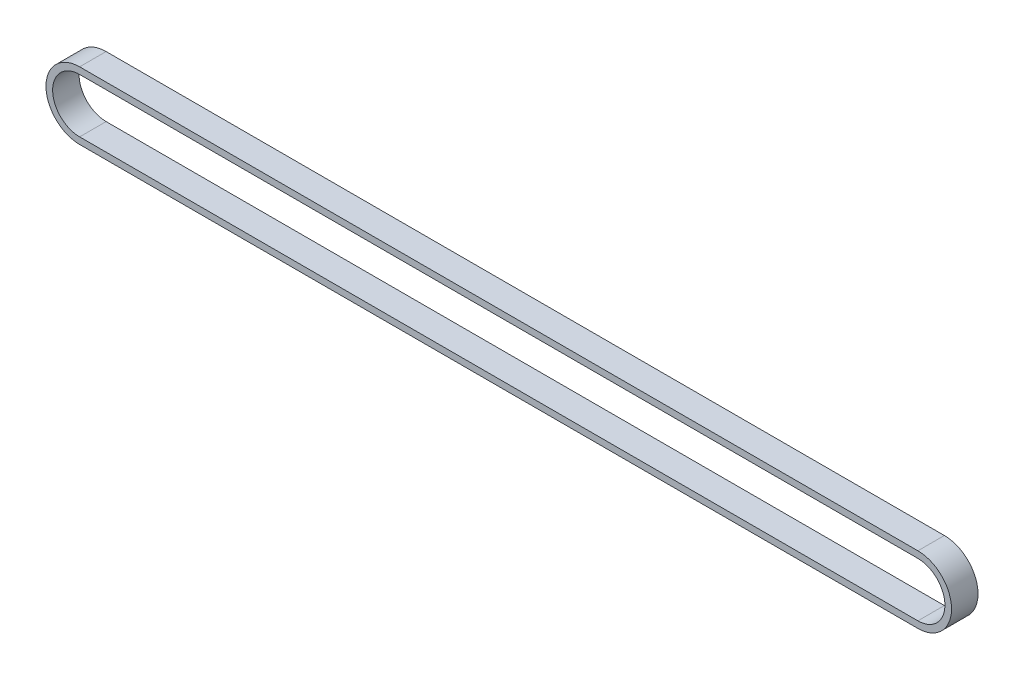
ISO-10303-21;
HEADER;
FILE_DESCRIPTION(('STEP AP214'),'2;1');
FILE_NAME('part.step','',(''),(''),'','','');
FILE_SCHEMA(('AUTOMOTIVE_DESIGN { 1 0 10303 214 1 1 1 1 }'));
ENDSEC;
DATA;
#1=APPLICATION_CONTEXT('core data for automotive mechanical design processes');
#2=APPLICATION_PROTOCOL_DEFINITION('international standard','automotive_design',2000,#1);
#3=PRODUCT_CONTEXT('',#1,'mechanical');
#4=PRODUCT('Part','Part','',(#3));
#5=PRODUCT_RELATED_PRODUCT_CATEGORY('part','',(#4));
#6=PRODUCT_DEFINITION_FORMATION('','',#4);
#7=PRODUCT_DEFINITION_CONTEXT('part definition',#1,'design');
#8=PRODUCT_DEFINITION('design','',#6,#7);
#9=PRODUCT_DEFINITION_SHAPE('','',#8);
#10=(LENGTH_UNIT() NAMED_UNIT(*) SI_UNIT(.MILLI.,.METRE.));
#11=(NAMED_UNIT(*) PLANE_ANGLE_UNIT() SI_UNIT($,.RADIAN.));
#12=(NAMED_UNIT(*) SI_UNIT($,.STERADIAN.) SOLID_ANGLE_UNIT());
#13=UNCERTAINTY_MEASURE_WITH_UNIT(LENGTH_MEASURE(1.E-05),#10,'distance_accuracy_value','');
#14=(GEOMETRIC_REPRESENTATION_CONTEXT(3) GLOBAL_UNCERTAINTY_ASSIGNED_CONTEXT((#13)) GLOBAL_UNIT_ASSIGNED_CONTEXT((#10,
#11,#12)) REPRESENTATION_CONTEXT('',''));
#15=CARTESIAN_POINT('',(0.,0.,0.));
#16=DIRECTION('',(0.,0.,1.));
#17=DIRECTION('',(1.,0.,0.));
#18=AXIS2_PLACEMENT_3D('',#15,#16,#17);
#19=CARTESIAN_POINT('',(0.,0.,6.));
#20=DIRECTION('',(0.,0.,1.));
#21=DIRECTION('',(1.,0.,0.));
#22=AXIS2_PLACEMENT_3D('',#19,#20,#21);
#23=PLANE('',#22);
#24=CARTESIAN_POINT('',(0.,0.,6.));
#25=DIRECTION('',(0.,0.,1.));
#26=DIRECTION('',(1.,0.,0.));
#27=AXIS2_PLACEMENT_3D('',#24,#25,#26);
#28=CIRCLE('',#27,7.62499999999999);
#29=CARTESIAN_POINT('',(0.,7.62499999999999,6.));
#30=VERTEX_POINT('',#29);
#31=CARTESIAN_POINT('',(0.,-7.62499999999999,6.));
#32=VERTEX_POINT('',#31);
#33=EDGE_CURVE('E135',#30,#32,#28,.T.);
#34=ORIENTED_EDGE('',*,*,#33,.T.);
#35=DIRECTION('',(1.,0.,0.));
#36=VECTOR('',#35,1.);
#37=CARTESIAN_POINT('',(0.,-7.62499999999999,6.));
#38=LINE('',#37,#36);
#39=CARTESIAN_POINT('',(190.,-7.625,6.));
#40=VERTEX_POINT('',#39);
#41=EDGE_CURVE('E138',#32,#40,#38,.T.);
#42=ORIENTED_EDGE('',*,*,#41,.T.);
#43=CARTESIAN_POINT('',(190.,0.,6.));
#44=DIRECTION('',(0.,0.,1.));
#45=DIRECTION('',(1.,0.,0.));
#46=AXIS2_PLACEMENT_3D('',#43,#44,#45);
#47=CIRCLE('',#46,7.625);
#48=CARTESIAN_POINT('',(190.,7.625,6.));
#49=VERTEX_POINT('',#48);
#50=EDGE_CURVE('E141',#40,#49,#47,.T.);
#51=ORIENTED_EDGE('',*,*,#50,.T.);
#52=DIRECTION('',(-1.,0.,0.));
#53=VECTOR('',#52,1.);
#54=CARTESIAN_POINT('',(0.,7.62499999999999,6.));
#55=LINE('',#54,#53);
#56=EDGE_CURVE('E143',#49,#30,#55,.T.);
#57=ORIENTED_EDGE('',*,*,#56,.T.);
#58=EDGE_LOOP('',(#34,#42,#51,#57));
#59=FACE_BOUND('',#58,.T.);
#60=DIRECTION('',(1.,0.,0.));
#61=VECTOR('',#60,1.);
#62=CARTESIAN_POINT('',(0.,-6.125,6.));
#63=LINE('',#62,#61);
#64=CARTESIAN_POINT('',(0.,-6.125,6.));
#65=VERTEX_POINT('',#64);
#66=CARTESIAN_POINT('',(190.,-6.125,6.));
#67=VERTEX_POINT('',#66);
#68=EDGE_CURVE('E107',#65,#67,#63,.T.);
#69=ORIENTED_EDGE('',*,*,#68,.F.);
#70=CARTESIAN_POINT('',(0.,0.,6.));
#71=DIRECTION('',(0.,0.,1.));
#72=DIRECTION('',(1.,0.,0.));
#73=AXIS2_PLACEMENT_3D('',#70,#71,#72);
#74=CIRCLE('',#73,6.125);
#75=CARTESIAN_POINT('',(0.,6.125,6.));
#76=VERTEX_POINT('',#75);
#77=EDGE_CURVE('E99',#76,#65,#74,.T.);
#78=ORIENTED_EDGE('',*,*,#77,.F.);
#79=DIRECTION('',(-1.,0.,0.));
#80=VECTOR('',#79,1.);
#81=CARTESIAN_POINT('',(0.,6.125,6.));
#82=LINE('',#81,#80);
#83=CARTESIAN_POINT('',(190.,6.125,6.));
#84=VERTEX_POINT('',#83);
#85=EDGE_CURVE('E121',#84,#76,#82,.T.);
#86=ORIENTED_EDGE('',*,*,#85,.F.);
#87=CARTESIAN_POINT('',(190.,0.,6.));
#88=DIRECTION('',(0.,0.,1.));
#89=DIRECTION('',(1.,0.,0.));
#90=AXIS2_PLACEMENT_3D('',#87,#88,#89);
#91=CIRCLE('',#90,6.125);
#92=EDGE_CURVE('E119',#67,#84,#91,.T.);
#93=ORIENTED_EDGE('',*,*,#92,.F.);
#94=EDGE_LOOP('',(#69,#78,#86,#93));
#95=FACE_BOUND('',#94,.T.);
#96=ADVANCED_FACE('F34',(#59,#95),#23,.T.);
#97=CARTESIAN_POINT('',(0.,0.,0.));
#98=DIRECTION('',(0.,0.,1.));
#99=DIRECTION('',(1.,0.,0.));
#100=AXIS2_PLACEMENT_3D('',#97,#98,#99);
#101=PLANE('',#100);
#102=CARTESIAN_POINT('',(0.,0.,0.));
#103=DIRECTION('',(0.,0.,1.));
#104=DIRECTION('',(1.,0.,0.));
#105=AXIS2_PLACEMENT_3D('',#102,#103,#104);
#106=CIRCLE('',#105,7.62499999999999);
#107=CARTESIAN_POINT('',(0.,7.62499999999999,0.));
#108=VERTEX_POINT('',#107);
#109=CARTESIAN_POINT('',(0.,-7.62499999999999,0.));
#110=VERTEX_POINT('',#109);
#111=EDGE_CURVE('E115',#108,#110,#106,.T.);
#112=ORIENTED_EDGE('',*,*,#111,.F.);
#113=DIRECTION('',(-1.,0.,0.));
#114=VECTOR('',#113,1.);
#115=CARTESIAN_POINT('',(0.,7.62499999999999,0.));
#116=LINE('',#115,#114);
#117=CARTESIAN_POINT('',(190.,7.625,0.));
#118=VERTEX_POINT('',#117);
#119=EDGE_CURVE('E139',#118,#108,#116,.T.);
#120=ORIENTED_EDGE('',*,*,#119,.F.);
#121=CARTESIAN_POINT('',(190.,0.,0.));
#122=DIRECTION('',(0.,0.,1.));
#123=DIRECTION('',(1.,0.,0.));
#124=AXIS2_PLACEMENT_3D('',#121,#122,#123);
#125=CIRCLE('',#124,7.625);
#126=CARTESIAN_POINT('',(190.,-7.625,0.));
#127=VERTEX_POINT('',#126);
#128=EDGE_CURVE('E150',#127,#118,#125,.T.);
#129=ORIENTED_EDGE('',*,*,#128,.F.);
#130=DIRECTION('',(1.,0.,0.));
#131=VECTOR('',#130,1.);
#132=CARTESIAN_POINT('',(0.,-7.62499999999999,0.));
#133=LINE('',#132,#131);
#134=EDGE_CURVE('E148',#110,#127,#133,.T.);
#135=ORIENTED_EDGE('',*,*,#134,.F.);
#136=EDGE_LOOP('',(#112,#120,#129,#135));
#137=FACE_BOUND('',#136,.T.);
#138=CARTESIAN_POINT('',(0.,0.,0.));
#139=DIRECTION('',(0.,0.,1.));
#140=DIRECTION('',(1.,0.,0.));
#141=AXIS2_PLACEMENT_3D('',#138,#139,#140);
#142=CIRCLE('',#141,6.125);
#143=CARTESIAN_POINT('',(0.,6.125,0.));
#144=VERTEX_POINT('',#143);
#145=CARTESIAN_POINT('',(0.,-6.125,0.));
#146=VERTEX_POINT('',#145);
#147=EDGE_CURVE('E57',#144,#146,#142,.T.);
#148=ORIENTED_EDGE('',*,*,#147,.T.);
#149=DIRECTION('',(1.,0.,0.));
#150=VECTOR('',#149,1.);
#151=CARTESIAN_POINT('',(0.,-6.125,0.));
#152=LINE('',#151,#150);
#153=CARTESIAN_POINT('',(190.,-6.125,0.));
#154=VERTEX_POINT('',#153);
#155=EDGE_CURVE('E114',#146,#154,#152,.T.);
#156=ORIENTED_EDGE('',*,*,#155,.T.);
#157=CARTESIAN_POINT('',(190.,0.,0.));
#158=DIRECTION('',(0.,0.,1.));
#159=DIRECTION('',(1.,0.,0.));
#160=AXIS2_PLACEMENT_3D('',#157,#158,#159);
#161=CIRCLE('',#160,6.125);
#162=CARTESIAN_POINT('',(190.,6.125,0.));
#163=VERTEX_POINT('',#162);
#164=EDGE_CURVE('E127',#154,#163,#161,.T.);
#165=ORIENTED_EDGE('',*,*,#164,.T.);
#166=DIRECTION('',(-1.,0.,0.));
#167=VECTOR('',#166,1.);
#168=CARTESIAN_POINT('',(0.,6.125,0.));
#169=LINE('',#168,#167);
#170=EDGE_CURVE('E108',#163,#144,#169,.T.);
#171=ORIENTED_EDGE('',*,*,#170,.T.);
#172=EDGE_LOOP('',(#148,#156,#165,#171));
#173=FACE_BOUND('',#172,.T.);
#174=ADVANCED_FACE('F168',(#137,#173),#101,.F.);
#175=CARTESIAN_POINT('',(0.,0.,6.));
#176=DIRECTION('',(0.,0.,-1.));
#177=DIRECTION('',(-1.,0.,0.));
#178=AXIS2_PLACEMENT_3D('',#175,#176,#177);
#179=CYLINDRICAL_SURFACE('',#178,7.62499999999999);
#180=ORIENTED_EDGE('',*,*,#111,.T.);
#181=DIRECTION('',(0.,0.,-1.));
#182=VECTOR('',#181,1.);
#183=CARTESIAN_POINT('',(0.,-7.62499999999999,6.));
#184=LINE('',#183,#182);
#185=EDGE_CURVE('E11',#32,#110,#184,.T.);
#186=ORIENTED_EDGE('',*,*,#185,.F.);
#187=ORIENTED_EDGE('',*,*,#33,.F.);
#188=DIRECTION('',(0.,0.,-1.));
#189=VECTOR('',#188,1.);
#190=CARTESIAN_POINT('',(0.,7.62499999999999,6.));
#191=LINE('',#190,#189);
#192=EDGE_CURVE('E145',#30,#108,#191,.T.);
#193=ORIENTED_EDGE('',*,*,#192,.T.);
#194=EDGE_LOOP('',(#180,#186,#187,#193));
#195=FACE_BOUND('',#194,.T.);
#196=ADVANCED_FACE('F36',(#195),#179,.T.);
#197=CARTESIAN_POINT('',(0.,-7.62499999999999,6.));
#198=DIRECTION('',(0.,1.,0.));
#199=DIRECTION('',(-1.,0.,0.));
#200=AXIS2_PLACEMENT_3D('',#197,#198,#199);
#201=PLANE('',#200);
#202=ORIENTED_EDGE('',*,*,#134,.T.);
#203=DIRECTION('',(0.,0.,-1.));
#204=VECTOR('',#203,1.);
#205=CARTESIAN_POINT('',(190.,-7.625,6.));
#206=LINE('',#205,#204);
#207=EDGE_CURVE('E42',#40,#127,#206,.T.);
#208=ORIENTED_EDGE('',*,*,#207,.F.);
#209=ORIENTED_EDGE('',*,*,#41,.F.);
#210=ORIENTED_EDGE('',*,*,#185,.T.);
#211=EDGE_LOOP('',(#202,#208,#209,#210));
#212=FACE_BOUND('',#211,.T.);
#213=ADVANCED_FACE('F178',(#212),#201,.F.);
#214=CARTESIAN_POINT('',(190.,0.,6.));
#215=DIRECTION('',(0.,0.,-1.));
#216=DIRECTION('',(-1.,0.,0.));
#217=AXIS2_PLACEMENT_3D('',#214,#215,#216);
#218=CYLINDRICAL_SURFACE('',#217,7.625);
#219=ORIENTED_EDGE('',*,*,#128,.T.);
#220=DIRECTION('',(0.,0.,-1.));
#221=VECTOR('',#220,1.);
#222=CARTESIAN_POINT('',(190.,7.625,6.));
#223=LINE('',#222,#221);
#224=EDGE_CURVE('E155',#49,#118,#223,.T.);
#225=ORIENTED_EDGE('',*,*,#224,.F.);
#226=ORIENTED_EDGE('',*,*,#50,.F.);
#227=ORIENTED_EDGE('',*,*,#207,.T.);
#228=EDGE_LOOP('',(#219,#225,#226,#227));
#229=FACE_BOUND('',#228,.T.);
#230=ADVANCED_FACE('F162',(#229),#218,.T.);
#231=CARTESIAN_POINT('',(0.,7.62499999999999,6.));
#232=DIRECTION('',(0.,-1.,0.));
#233=DIRECTION('',(1.,0.,0.));
#234=AXIS2_PLACEMENT_3D('',#231,#232,#233);
#235=PLANE('',#234);
#236=ORIENTED_EDGE('',*,*,#119,.T.);
#237=ORIENTED_EDGE('',*,*,#192,.F.);
#238=ORIENTED_EDGE('',*,*,#56,.F.);
#239=ORIENTED_EDGE('',*,*,#224,.T.);
#240=EDGE_LOOP('',(#236,#237,#238,#239));
#241=FACE_BOUND('',#240,.T.);
#242=ADVANCED_FACE('F172',(#241),#235,.F.);
#243=CARTESIAN_POINT('',(0.,0.,6.));
#244=DIRECTION('',(0.,0.,-1.));
#245=DIRECTION('',(-1.,0.,0.));
#246=AXIS2_PLACEMENT_3D('',#243,#244,#245);
#247=CYLINDRICAL_SURFACE('',#246,6.125);
#248=ORIENTED_EDGE('',*,*,#147,.F.);
#249=DIRECTION('',(0.,0.,-1.));
#250=VECTOR('',#249,1.);
#251=CARTESIAN_POINT('',(0.,6.125,6.));
#252=LINE('',#251,#250);
#253=EDGE_CURVE('E103',#76,#144,#252,.T.);
#254=ORIENTED_EDGE('',*,*,#253,.F.);
#255=ORIENTED_EDGE('',*,*,#77,.T.);
#256=DIRECTION('',(0.,0.,-1.));
#257=VECTOR('',#256,1.);
#258=CARTESIAN_POINT('',(0.,-6.125,6.));
#259=LINE('',#258,#257);
#260=EDGE_CURVE('E102',#65,#146,#259,.T.);
#261=ORIENTED_EDGE('',*,*,#260,.T.);
#262=EDGE_LOOP('',(#248,#254,#255,#261));
#263=FACE_BOUND('',#262,.T.);
#264=ADVANCED_FACE('F101',(#263),#247,.F.);
#265=CARTESIAN_POINT('',(0.,-6.125,6.));
#266=DIRECTION('',(0.,1.,0.));
#267=DIRECTION('',(0.,0.,1.));
#268=AXIS2_PLACEMENT_3D('',#265,#266,#267);
#269=PLANE('',#268);
#270=ORIENTED_EDGE('',*,*,#155,.F.);
#271=ORIENTED_EDGE('',*,*,#260,.F.);
#272=ORIENTED_EDGE('',*,*,#68,.T.);
#273=DIRECTION('',(0.,0.,-1.));
#274=VECTOR('',#273,1.);
#275=CARTESIAN_POINT('',(190.,-6.125,6.));
#276=LINE('',#275,#274);
#277=EDGE_CURVE('E116',#67,#154,#276,.T.);
#278=ORIENTED_EDGE('',*,*,#277,.T.);
#279=EDGE_LOOP('',(#270,#271,#272,#278));
#280=FACE_BOUND('',#279,.T.);
#281=ADVANCED_FACE('F111',(#280),#269,.T.);
#282=CARTESIAN_POINT('',(190.,0.,6.));
#283=DIRECTION('',(0.,0.,-1.));
#284=DIRECTION('',(-1.,0.,0.));
#285=AXIS2_PLACEMENT_3D('',#282,#283,#284);
#286=CYLINDRICAL_SURFACE('',#285,6.125);
#287=ORIENTED_EDGE('',*,*,#164,.F.);
#288=ORIENTED_EDGE('',*,*,#277,.F.);
#289=ORIENTED_EDGE('',*,*,#92,.T.);
#290=DIRECTION('',(0.,0.,-1.));
#291=VECTOR('',#290,1.);
#292=CARTESIAN_POINT('',(190.,6.125,6.));
#293=LINE('',#292,#291);
#294=EDGE_CURVE('E49',#84,#163,#293,.T.);
#295=ORIENTED_EDGE('',*,*,#294,.T.);
#296=EDGE_LOOP('',(#287,#288,#289,#295));
#297=FACE_BOUND('',#296,.T.);
#298=ADVANCED_FACE('F201',(#297),#286,.F.);
#299=CARTESIAN_POINT('',(0.,6.125,6.));
#300=DIRECTION('',(0.,-1.,0.));
#301=DIRECTION('',(0.,0.,-1.));
#302=AXIS2_PLACEMENT_3D('',#299,#300,#301);
#303=PLANE('',#302);
#304=ORIENTED_EDGE('',*,*,#170,.F.);
#305=ORIENTED_EDGE('',*,*,#294,.F.);
#306=ORIENTED_EDGE('',*,*,#85,.T.);
#307=ORIENTED_EDGE('',*,*,#253,.T.);
#308=EDGE_LOOP('',(#304,#305,#306,#307));
#309=FACE_BOUND('',#308,.T.);
#310=ADVANCED_FACE('F205',(#309),#303,.T.);
#311=CLOSED_SHELL('',(#96,#174,#196,#213,#230,#242,#264,#281,#298,#310));
#312=MANIFOLD_SOLID_BREP('B2',#311);
#313=ADVANCED_BREP_SHAPE_REPRESENTATION('',(#18,#312),#14);
#314=SHAPE_DEFINITION_REPRESENTATION(#9,#313);
ENDSEC;
END-ISO-10303-21;
